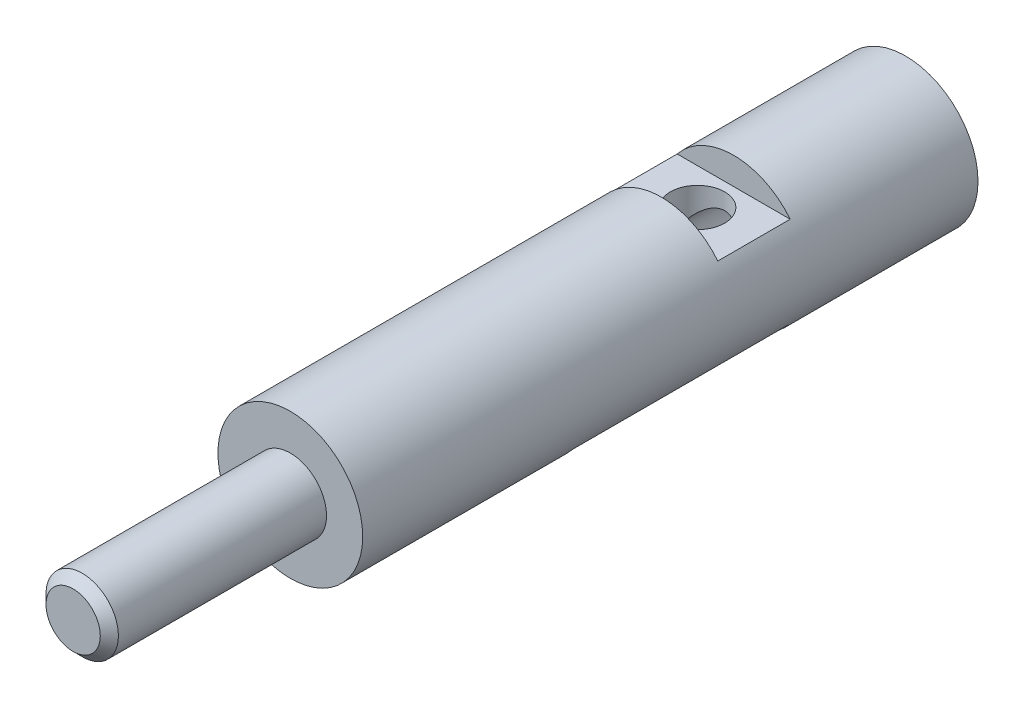
ISO-10303-21;
HEADER;
FILE_DESCRIPTION(('STEP AP214'),'2;1');
FILE_NAME('part.step','',(''),(''),'','','');
FILE_SCHEMA(('AUTOMOTIVE_DESIGN { 1 0 10303 214 1 1 1 1 }'));
ENDSEC;
DATA;
#1=APPLICATION_CONTEXT('core data for automotive mechanical design processes');
#2=APPLICATION_PROTOCOL_DEFINITION('international standard','automotive_design',2000,#1);
#3=PRODUCT_CONTEXT('',#1,'mechanical');
#4=PRODUCT('Part','Part','',(#3));
#5=PRODUCT_RELATED_PRODUCT_CATEGORY('part','',(#4));
#6=PRODUCT_DEFINITION_FORMATION('','',#4);
#7=PRODUCT_DEFINITION_CONTEXT('part definition',#1,'design');
#8=PRODUCT_DEFINITION('design','',#6,#7);
#9=PRODUCT_DEFINITION_SHAPE('','',#8);
#10=(LENGTH_UNIT() NAMED_UNIT(*) SI_UNIT(.MILLI.,.METRE.));
#11=(NAMED_UNIT(*) PLANE_ANGLE_UNIT() SI_UNIT($,.RADIAN.));
#12=(NAMED_UNIT(*) SI_UNIT($,.STERADIAN.) SOLID_ANGLE_UNIT());
#13=UNCERTAINTY_MEASURE_WITH_UNIT(LENGTH_MEASURE(1.E-05),#10,'distance_accuracy_value','');
#14=(GEOMETRIC_REPRESENTATION_CONTEXT(3) GLOBAL_UNCERTAINTY_ASSIGNED_CONTEXT((#13)) GLOBAL_UNIT_ASSIGNED_CONTEXT((#10,
#11,#12)) REPRESENTATION_CONTEXT('',''));
#15=CARTESIAN_POINT('',(0.,0.,0.));
#16=DIRECTION('',(0.,0.,1.));
#17=DIRECTION('',(1.,0.,0.));
#18=AXIS2_PLACEMENT_3D('',#15,#16,#17);
#19=CARTESIAN_POINT('',(0.,0.,-34.));
#20=DIRECTION('',(0.,0.,1.));
#21=DIRECTION('',(1.,0.,0.));
#22=AXIS2_PLACEMENT_3D('',#19,#20,#21);
#23=CYLINDRICAL_SURFACE('',#22,4.);
#24=DIRECTION('',(0.,0.,1.));
#25=VECTOR('',#24,1.);
#26=CARTESIAN_POINT('',(-3.1224989991992,-2.5,-34.));
#27=LINE('',#26,#25);
#28=CARTESIAN_POINT('',(-3.1224989991992,-2.5,-12.5));
#29=VERTEX_POINT('',#28);
#30=CARTESIAN_POINT('',(-3.1224989991992,-2.5,-24.5));
#31=VERTEX_POINT('',#30);
#32=EDGE_CURVE('E11',#29,#31,#27,.F.);
#33=ORIENTED_EDGE('',*,*,#32,.F.);
#34=CARTESIAN_POINT('',(0.,0.,-12.5));
#35=DIRECTION('',(0.,0.,1.));
#36=DIRECTION('',(1.,0.,0.));
#37=AXIS2_PLACEMENT_3D('',#34,#35,#36);
#38=CIRCLE('',#37,4.);
#39=CARTESIAN_POINT('',(3.1224989991992,-2.5,-12.5));
#40=VERTEX_POINT('',#39);
#41=EDGE_CURVE('E131',#40,#29,#38,.F.);
#42=ORIENTED_EDGE('',*,*,#41,.F.);
#43=DIRECTION('',(0.,0.,1.));
#44=VECTOR('',#43,1.);
#45=CARTESIAN_POINT('',(3.1224989991992,-2.5,-34.));
#46=LINE('',#45,#44);
#47=CARTESIAN_POINT('',(3.1224989991992,-2.5,-24.5));
#48=VERTEX_POINT('',#47);
#49=EDGE_CURVE('E95',#48,#40,#46,.T.);
#50=ORIENTED_EDGE('',*,*,#49,.F.);
#51=CARTESIAN_POINT('',(0.,0.,-24.5));
#52=DIRECTION('',(0.,0.,-1.));
#53=DIRECTION('',(-1.,0.,0.));
#54=AXIS2_PLACEMENT_3D('',#51,#52,#53);
#55=CIRCLE('',#54,4.);
#56=EDGE_CURVE('E45',#31,#48,#55,.F.);
#57=ORIENTED_EDGE('',*,*,#56,.F.);
#58=EDGE_LOOP('',(#33,#42,#50,#57));
#59=FACE_BOUND('',#58,.T.);
#60=CARTESIAN_POINT('',(0.,0.,-20.5));
#61=DIRECTION('',(0.,0.,1.));
#62=DIRECTION('',(1.,0.,0.));
#63=AXIS2_PLACEMENT_3D('',#60,#61,#62);
#64=CIRCLE('',#63,4.);
#65=CARTESIAN_POINT('',(-3.1224989991992,2.5,-20.5));
#66=VERTEX_POINT('',#65);
#67=CARTESIAN_POINT('',(3.1224989991992,2.5,-20.5));
#68=VERTEX_POINT('',#67);
#69=EDGE_CURVE('E78',#66,#68,#64,.F.);
#70=ORIENTED_EDGE('',*,*,#69,.F.);
#71=DIRECTION('',(0.,0.,1.));
#72=VECTOR('',#71,1.);
#73=CARTESIAN_POINT('',(-3.1224989991992,2.5,-34.));
#74=LINE('',#73,#72);
#75=CARTESIAN_POINT('',(-3.1224989991992,2.5,-24.5));
#76=VERTEX_POINT('',#75);
#77=EDGE_CURVE('E81',#76,#66,#74,.T.);
#78=ORIENTED_EDGE('',*,*,#77,.F.);
#79=CARTESIAN_POINT('',(0.,0.,-24.5));
#80=DIRECTION('',(0.,0.,-1.));
#81=DIRECTION('',(-1.,0.,0.));
#82=AXIS2_PLACEMENT_3D('',#79,#80,#81);
#83=CIRCLE('',#82,4.);
#84=CARTESIAN_POINT('',(3.1224989991992,2.5,-24.5));
#85=VERTEX_POINT('',#84);
#86=EDGE_CURVE('E96',#85,#76,#83,.F.);
#87=ORIENTED_EDGE('',*,*,#86,.F.);
#88=DIRECTION('',(0.,0.,1.));
#89=VECTOR('',#88,1.);
#90=CARTESIAN_POINT('',(3.1224989991992,2.5,-34.));
#91=LINE('',#90,#89);
#92=EDGE_CURVE('E83',#68,#85,#91,.F.);
#93=ORIENTED_EDGE('',*,*,#92,.F.);
#94=EDGE_LOOP('',(#70,#78,#87,#93));
#95=FACE_BOUND('',#94,.T.);
#96=CARTESIAN_POINT('',(0.,0.,-34.));
#97=DIRECTION('',(0.,0.,1.));
#98=DIRECTION('',(1.,0.,0.));
#99=AXIS2_PLACEMENT_3D('',#96,#97,#98);
#100=CIRCLE('',#99,4.);
#101=CARTESIAN_POINT('',(4.,0.,-34.));
#102=VERTEX_POINT('',#101);
#103=EDGE_CURVE('E119',#102,#102,#100,.T.);
#104=ORIENTED_EDGE('',*,*,#103,.T.);
#105=EDGE_LOOP('',(#104));
#106=FACE_BOUND('',#105,.T.);
#107=CARTESIAN_POINT('',(0.,0.,0.));
#108=DIRECTION('',(0.,0.,1.));
#109=DIRECTION('',(1.,0.,0.));
#110=AXIS2_PLACEMENT_3D('',#107,#108,#109);
#111=CIRCLE('',#110,4.);
#112=CARTESIAN_POINT('',(4.,0.,0.));
#113=VERTEX_POINT('',#112);
#114=EDGE_CURVE('E114',#113,#113,#111,.T.);
#115=ORIENTED_EDGE('',*,*,#114,.F.);
#116=EDGE_LOOP('',(#115));
#117=FACE_BOUND('',#116,.T.);
#118=ADVANCED_FACE('F36',(#59,#95,#106,#117),#23,.T.);
#119=CARTESIAN_POINT('',(0.,0.,-34.));
#120=DIRECTION('',(0.,0.,1.));
#121=DIRECTION('',(1.,0.,0.));
#122=AXIS2_PLACEMENT_3D('',#119,#120,#121);
#123=PLANE('',#122);
#124=CARTESIAN_POINT('',(0.,0.,-34.));
#125=DIRECTION('',(0.,0.,-1.));
#126=DIRECTION('',(-1.,0.,0.));
#127=AXIS2_PLACEMENT_3D('',#124,#125,#126);
#128=CIRCLE('',#127,1.59999999999999);
#129=CARTESIAN_POINT('',(-1.59999999999999,0.,-34.));
#130=VERTEX_POINT('',#129);
#131=EDGE_CURVE('E107',#130,#130,#128,.T.);
#132=ORIENTED_EDGE('',*,*,#131,.F.);
#133=EDGE_LOOP('',(#132));
#134=FACE_BOUND('',#133,.T.);
#135=ORIENTED_EDGE('',*,*,#103,.F.);
#136=EDGE_LOOP('',(#135));
#137=FACE_BOUND('',#136,.T.);
#138=ADVANCED_FACE('F163',(#134,#137),#123,.F.);
#139=CARTESIAN_POINT('',(0.,0.,0.));
#140=DIRECTION('',(0.,0.,1.));
#141=DIRECTION('',(1.,0.,0.));
#142=AXIS2_PLACEMENT_3D('',#139,#140,#141);
#143=PLANE('',#142);
#144=CARTESIAN_POINT('',(0.,0.,0.));
#145=DIRECTION('',(0.,0.,1.));
#146=DIRECTION('',(1.,0.,0.));
#147=AXIS2_PLACEMENT_3D('',#144,#145,#146);
#148=CIRCLE('',#147,2.);
#149=CARTESIAN_POINT('',(2.,0.,0.));
#150=VERTEX_POINT('',#149);
#151=EDGE_CURVE('E115',#150,#150,#148,.T.);
#152=ORIENTED_EDGE('',*,*,#151,.F.);
#153=EDGE_LOOP('',(#152));
#154=FACE_BOUND('',#153,.T.);
#155=ORIENTED_EDGE('',*,*,#114,.T.);
#156=EDGE_LOOP('',(#155));
#157=FACE_BOUND('',#156,.T.);
#158=ADVANCED_FACE('F167',(#154,#157),#143,.T.);
#159=CARTESIAN_POINT('',(0.,0.,12.));
#160=DIRECTION('',(0.,0.,-1.));
#161=DIRECTION('',(-1.,0.,0.));
#162=AXIS2_PLACEMENT_3D('',#159,#160,#161);
#163=CYLINDRICAL_SURFACE('',#162,2.);
#164=CARTESIAN_POINT('',(0.,0.,11.5));
#165=DIRECTION('',(0.,0.,1.));
#166=DIRECTION('',(1.,0.,0.));
#167=AXIS2_PLACEMENT_3D('',#164,#165,#166);
#168=CIRCLE('',#167,2.);
#169=CARTESIAN_POINT('',(2.,0.,11.5));
#170=VERTEX_POINT('',#169);
#171=EDGE_CURVE('E87',#170,#170,#168,.F.);
#172=ORIENTED_EDGE('',*,*,#171,.T.);
#173=EDGE_LOOP('',(#172));
#174=FACE_BOUND('',#173,.T.);
#175=ORIENTED_EDGE('',*,*,#151,.T.);
#176=EDGE_LOOP('',(#175));
#177=FACE_BOUND('',#176,.T.);
#178=ADVANCED_FACE('F172',(#174,#177),#163,.T.);
#179=CARTESIAN_POINT('',(0.,0.,12.));
#180=DIRECTION('',(0.,0.,1.));
#181=DIRECTION('',(1.,0.,0.));
#182=AXIS2_PLACEMENT_3D('',#179,#180,#181);
#183=PLANE('',#182);
#184=CARTESIAN_POINT('',(0.,0.,12.));
#185=DIRECTION('',(0.,0.,1.));
#186=DIRECTION('',(1.,0.,0.));
#187=AXIS2_PLACEMENT_3D('',#184,#185,#186);
#188=CIRCLE('',#187,1.5);
#189=CARTESIAN_POINT('',(1.5,0.,12.));
#190=VERTEX_POINT('',#189);
#191=EDGE_CURVE('E118',#190,#190,#188,.T.);
#192=ORIENTED_EDGE('',*,*,#191,.T.);
#193=EDGE_LOOP('',(#192));
#194=FACE_BOUND('',#193,.T.);
#195=ADVANCED_FACE('F177',(#194),#183,.T.);
#196=CARTESIAN_POINT('',(0.,0.,12.));
#197=DIRECTION('',(0.,0.,-1.));
#198=DIRECTION('',(-1.,0.,0.));
#199=AXIS2_PLACEMENT_3D('',#196,#197,#198);
#200=CONICAL_SURFACE('',#199,1.5,0.785398163397441);
#201=ORIENTED_EDGE('',*,*,#171,.F.);
#202=EDGE_LOOP('',(#201));
#203=FACE_BOUND('',#202,.T.);
#204=ORIENTED_EDGE('',*,*,#191,.F.);
#205=EDGE_LOOP('',(#204));
#206=FACE_BOUND('',#205,.T.);
#207=ADVANCED_FACE('F39',(#203,#206),#200,.T.);
#208=CARTESIAN_POINT('',(0.,0.,-20.));
#209=DIRECTION('',(0.,0.,-1.));
#210=DIRECTION('',(-1.,0.,0.));
#211=AXIS2_PLACEMENT_3D('',#208,#209,#210);
#212=CONICAL_SURFACE('',#211,1.59999999999999,1.02974425867665);
#213=CARTESIAN_POINT('',(0.,0.,-19.0386230095559));
#214=VERTEX_POINT('',#213);
#215=VERTEX_LOOP('',#214);
#216=FACE_BOUND('',#215,.T.);
#217=CARTESIAN_POINT('',(0.,0.,-20.));
#218=DIRECTION('',(0.,0.,-1.));
#219=DIRECTION('',(-1.,0.,0.));
#220=AXIS2_PLACEMENT_3D('',#217,#218,#219);
#221=CIRCLE('',#220,1.59999999999999);
#222=CARTESIAN_POINT('',(-1.59999999999999,0.,-20.));
#223=VERTEX_POINT('',#222);
#224=EDGE_CURVE('E110',#223,#223,#221,.T.);
#225=ORIENTED_EDGE('',*,*,#224,.T.);
#226=EDGE_LOOP('',(#225));
#227=FACE_BOUND('',#226,.T.);
#228=ADVANCED_FACE('F182',(#216,#227),#212,.F.);
#229=CARTESIAN_POINT('',(0.,0.,-34.));
#230=DIRECTION('',(0.,0.,-1.));
#231=DIRECTION('',(-1.,0.,0.));
#232=AXIS2_PLACEMENT_3D('',#229,#230,#231);
#233=CYLINDRICAL_SURFACE('',#232,1.59999999999999);
#234=CARTESIAN_POINT('',(0.,1.59999999999999,-21.));
#235=CARTESIAN_POINT('',(0.0684255819523115,1.59999100993067,-21.0000090962978));
#236=CARTESIAN_POINT('',(0.136969761419658,1.59556467819542,-21.0047281971338));
#237=CARTESIAN_POINT('',(0.271820864103848,1.57821703920185,-21.0232539049869));
#238=CARTESIAN_POINT('',(0.338120531372211,1.56527051953187,-21.0370874831407));
#239=CARTESIAN_POINT('',(0.466029039157556,1.53204181361779,-21.0726973534836));
#240=CARTESIAN_POINT('',(0.527667983699459,1.51181264687308,-21.0944162480474));
#241=CARTESIAN_POINT('',(0.645624057326145,1.46533125031908,-21.1445358019232));
#242=CARTESIAN_POINT('',(0.701942648568485,1.43908068217026,-21.172934617905));
#243=CARTESIAN_POINT('',(0.830488511004102,1.37023549959972,-21.2478632281665));
#244=CARTESIAN_POINT('',(0.899909356040592,1.32532924968791,-21.2970760172881));
#245=CARTESIAN_POINT('',(1.02730053831725,1.22924745848653,-21.4038236725768));
#246=CARTESIAN_POINT('',(1.08523092595497,1.17805101301526,-21.4613864091608));
#247=CARTESIAN_POINT('',(1.17078105057247,1.09156202300322,-21.560920796247));
#248=CARTESIAN_POINT('',(1.20175833727903,1.05726375119173,-21.6009408086179));
#249=CARTESIAN_POINT('',(1.25930890566738,0.988010810145918,-21.6834986333497));
#250=CARTESIAN_POINT('',(1.28588281199331,0.953056234796473,-21.7260360874337));
#251=CARTESIAN_POINT('',(1.33467012957743,0.883435608136693,-21.8135864668672));
#252=CARTESIAN_POINT('',(1.35689236994422,0.848769112188214,-21.8585941376334));
#253=CARTESIAN_POINT('',(1.3970362278902,0.780917148192493,-21.9514994512178));
#254=CARTESIAN_POINT('',(1.4149635108398,0.747729776660344,-21.9993931815076));
#255=CARTESIAN_POINT('',(1.44158488802393,0.694574099514455,-22.0838822859475));
#256=CARTESIAN_POINT('',(1.45143080990949,0.673647073701059,-22.1195046105091));
#257=CARTESIAN_POINT('',(1.46874054388632,0.635016088570957,-22.1930368336448));
#258=CARTESIAN_POINT('',(1.47620697945578,0.61730858891845,-22.2309441576764));
#259=CARTESIAN_POINT('',(1.48710185280875,0.59050368055825,-22.3012201572755));
#260=CARTESIAN_POINT('',(1.49104694938892,0.580381760051778,-22.3331032235742));
#261=CARTESIAN_POINT('',(1.49689488628612,0.565132788162443,-22.3981894510155));
#262=CARTESIAN_POINT('',(1.49880415766172,0.559990012702316,-22.43138810952));
#263=CARTESIAN_POINT('',(1.50037685312532,0.555766816396757,-22.4985170672047));
#264=CARTESIAN_POINT('',(1.50002232907756,0.556734843369679,-22.5324510822661));
#265=CARTESIAN_POINT('',(1.49707243273785,0.564613886898896,-22.5995451956431));
#266=CARTESIAN_POINT('',(1.4944718971692,0.571538596916504,-22.6327033297862));
#267=CARTESIAN_POINT('',(1.48583868780731,0.593691355415244,-22.7107065522607));
#268=CARTESIAN_POINT('',(1.47883660489909,0.61115848127911,-22.7547767608288));
#269=CARTESIAN_POINT('',(1.46163501869308,0.651230780563985,-22.8398884700143));
#270=CARTESIAN_POINT('',(1.45142140048049,0.673858512219667,-22.8809155928408));
#271=CARTESIAN_POINT('',(1.42705633043944,0.724130291338575,-22.964295134449));
#272=CARTESIAN_POINT('',(1.41262082836606,0.752047417768069,-23.0063961883062));
#273=CARTESIAN_POINT('',(1.38053670392535,0.809448984794783,-23.0882594625083));
#274=CARTESIAN_POINT('',(1.36288484352602,0.838934983462915,-23.1280192719694));
#275=CARTESIAN_POINT('',(1.30513055308311,0.928246532931969,-23.2444222286512));
#276=CARTESIAN_POINT('',(1.26024681474812,0.988886891758755,-23.3181312163075));
#277=CARTESIAN_POINT('',(1.1522222614889,1.11350800341081,-23.4651426434821));
#278=CARTESIAN_POINT('',(1.08770668085879,1.17721837960239,-23.5376707660719));
#279=CARTESIAN_POINT('',(0.941971511717649,1.29672721862755,-23.6714935311562));
#280=CARTESIAN_POINT('',(0.860815124216952,1.35255430540363,-23.7328290638758));
#281=CARTESIAN_POINT('',(0.715544871064911,1.43250376355301,-23.8199381988512));
#282=CARTESIAN_POINT('',(0.656464639142331,1.46066194156334,-23.8504193629851));
#283=CARTESIAN_POINT('',(0.532380202594988,1.51030557076395,-23.9039676752676));
#284=CARTESIAN_POINT('',(0.467379935912664,1.53179541632509,-23.9270397063193));
#285=CARTESIAN_POINT('',(0.33215867953347,1.56671039192708,-23.964454412966));
#286=CARTESIAN_POINT('',(0.261898429302686,1.58006627656504,-23.9787221497356));
#287=CARTESIAN_POINT('',(0.118916949535167,1.59719349756616,-23.9970096377307));
#288=CARTESIAN_POINT('',(0.0461977442778965,1.60097253214485,-24.0010376200461));
#289=CARTESIAN_POINT('',(-0.0898241742949232,1.5987422645432,-23.9986581904231));
#290=CARTESIAN_POINT('',(-0.153173912852326,1.59389115980747,-23.9934855518758));
#291=CARTESIAN_POINT('',(-0.277753685333671,1.57696068243675,-23.975403365772));
#292=CARTESIAN_POINT('',(-0.338983446812114,1.56488038437404,-23.9624928276668));
#293=CARTESIAN_POINT('',(-0.457735986419063,1.53435147837037,-23.9297793136347));
#294=CARTESIAN_POINT('',(-0.515265285072292,1.51591445776733,-23.9099888781736));
#295=CARTESIAN_POINT('',(-0.625826321394367,1.47371929048371,-23.8645218804443));
#296=CARTESIAN_POINT('',(-0.678856869780198,1.44995974275386,-23.8388437683204));
#297=CARTESIAN_POINT('',(-0.804323666257094,1.38569203947423,-23.7690194645366));
#298=CARTESIAN_POINT('',(-0.873816485374856,1.34262645456978,-23.7219326921356));
#299=CARTESIAN_POINT('',(-1.00176463057464,1.25009328041173,-23.6194762183997));
#300=CARTESIAN_POINT('',(-1.06018192297002,1.20060457994,-23.5640791050474));
#301=CARTESIAN_POINT('',(-1.14747741148048,1.11605538641917,-23.467427064718));
#302=CARTESIAN_POINT('',(-1.17951966582664,1.08204019580845,-23.4280484924892));
#303=CARTESIAN_POINT('',(-1.23917518469031,1.01317225735417,-23.3467515587635));
#304=CARTESIAN_POINT('',(-1.26678887424383,0.978319590257882,-23.3048334415346));
#305=CARTESIAN_POINT('',(-1.31764191463906,0.908666765165579,-23.2185566928481));
#306=CARTESIAN_POINT('',(-1.3408897200146,0.87386663788399,-23.1742029978392));
#307=CARTESIAN_POINT('',(-1.38309994332713,0.805383294233543,-23.0827298984665));
#308=CARTESIAN_POINT('',(-1.40206704077596,0.771698892914996,-23.0356135858014));
#309=CARTESIAN_POINT('',(-1.43080243256963,0.716573830570112,-22.9518434003516));
#310=CARTESIAN_POINT('',(-1.44164985062664,0.694387989717442,-22.9160542008122));
#311=CARTESIAN_POINT('',(-1.46094173101544,0.652817311175956,-22.842208361234));
#312=CARTESIAN_POINT('',(-1.46938663186735,0.633431962644846,-22.8041521365202));
#313=CARTESIAN_POINT('',(-1.48226072963674,0.602605017567063,-22.7323453147986));
#314=CARTESIAN_POINT('',(-1.4871367841298,0.590364021627841,-22.6990307214481));
#315=CARTESIAN_POINT('',(-1.49468197065955,0.570995915270086,-22.6307524923585));
#316=CARTESIAN_POINT('',(-1.49735937115688,0.563849658605712,-22.5957955624773));
#317=CARTESIAN_POINT('',(-1.50022554535816,0.556188195946323,-22.5245568122864));
#318=CARTESIAN_POINT('',(-1.50038283453941,0.555756883688056,-22.4882639002271));
#319=CARTESIAN_POINT('',(-1.4980998148631,0.561875339118326,-22.4163325816119));
#320=CARTESIAN_POINT('',(-1.49565398700772,0.568439939227091,-22.380695729265));
#321=CARTESIAN_POINT('',(-1.48749788637684,0.589493082818544,-22.3016563649174));
#322=CARTESIAN_POINT('',(-1.48107662983668,0.605660277513019,-22.2588024446772));
#323=CARTESIAN_POINT('',(-1.46519284514556,0.643137620116819,-22.175957538847));
#324=CARTESIAN_POINT('',(-1.45571686428683,0.664470411421129,-22.1359801921781));
#325=CARTESIAN_POINT('',(-1.43308878736763,0.712049693883297,-22.0548129753519));
#326=CARTESIAN_POINT('',(-1.41967554469702,0.738569250729468,-22.0138601198267));
#327=CARTESIAN_POINT('',(-1.38985030146092,0.793280785771147,-21.9342061780958));
#328=CARTESIAN_POINT('',(-1.37343521142805,0.821474466580521,-21.8955074664367));
#329=CARTESIAN_POINT('',(-1.31974256303737,0.907082200617729,-21.7821589547871));
#330=CARTESIAN_POINT('',(-1.27803283329951,0.965488439995807,-21.7103094131892));
#331=CARTESIAN_POINT('',(-1.17693332909145,1.08712656870904,-21.5653838564812));
#332=CARTESIAN_POINT('',(-1.11604484000422,1.15012229053255,-21.4931500874728));
#333=CARTESIAN_POINT('',(-0.978384321159562,1.26925092061589,-21.3589749614362));
#334=CARTESIAN_POINT('',(-0.901663440053429,1.32540502482403,-21.2970015909359));
#335=CARTESIAN_POINT('',(-0.761516551758972,1.40863661354698,-21.2059900545818));
#336=CARTESIAN_POINT('',(-0.702656139422148,1.43905674895606,-21.1729707472108));
#337=CARTESIAN_POINT('',(-0.578477152845047,1.49329683004648,-21.1143373223451));
#338=CARTESIAN_POINT('',(-0.513162974258379,1.51712122660306,-21.0887182106105));
#339=CARTESIAN_POINT('',(-0.38620040814023,1.55390938239854,-21.0492492504271));
#340=CARTESIAN_POINT('',(-0.325189090831707,1.56788580592605,-21.0342986233955));
#341=CARTESIAN_POINT('',(-0.200670425393364,1.58861097203541,-21.0121489553886));
#342=CARTESIAN_POINT('',(-0.137170487817847,1.59537969972829,-21.0049284803625));
#343=CARTESIAN_POINT('',(-0.0489577110307394,1.59944074803711,-21.0005966544392));
#344=CARTESIAN_POINT('',(-0.0244864493340586,1.60000321714292,-20.9999967448427));
#345=CARTESIAN_POINT('',(0.,1.59999999999999,-21.));
#346=B_SPLINE_CURVE_WITH_KNOTS('',3,(#234,#235,#236,#237,#238,#239,#240,#241,#242,#243,#244,
#245,#246,#247,#248,#249,#250,#251,#252,#253,#254,#255,#256,#257,#258,#259,#260,#261,#262,#263,
#264,#265,#266,#267,#268,#269,#270,#271,#272,#273,#274,#275,#276,#277,#278,#279,#280,#281,#282,
#283,#284,#285,#286,#287,#288,#289,#290,#291,#292,#293,#294,#295,#296,#297,#298,#299,#300,#301,
#302,#303,#304,#305,#306,#307,#308,#309,#310,#311,#312,#313,#314,#315,#316,#317,#318,#319,#320,
#321,#322,#323,#324,#325,#326,#327,#328,#329,#330,#331,#332,#333,#334,#335,#336,#337,#338,#339,
#340,#341,#342,#343,#344,#345),.UNSPECIFIED.,.T.,.F.,(4,2,2,2,2,2,2,2,2,2,2,2,2,2,2,2,2,2,2,2,2,
2,2,2,2,2,2,2,2,2,2,2,2,2,2,2,2,2,2,2,2,2,2,2,2,2,2,2,2,2,2,2,2,2,2,4),(0.,0.205191194350401,
0.410992324539082,0.615324504475544,0.81960036478185,1.10668891633044,1.39475875441688,
1.57797159708169,1.76115842768928,1.94396964900547,2.1265383843133,2.25379522043879,
2.380911261514,2.48161669197437,2.58200304846302,2.68318628478433,2.78460274869496,
2.92755182236973,3.07113816175825,3.22851946560472,3.3860600955967,3.70135424338244,
4.04810638258293,4.39356518751196,4.60938269160767,4.82505767038768,5.04254394703589,
5.25985534488228,5.45015751158168,5.64048404456581,5.83046545960807,6.02049694236048,
6.30198386380244,6.58442057318483,6.76754781754563,6.95065747555072,7.13340880043478,
7.31595937010019,7.44626722225466,7.57655127464996,7.68369231421016,7.79042855986851,
7.89849726875138,8.00679555674797,8.14477595318692,8.28337249894482,8.4349475782737,
8.5866795440114,8.89033594061585,9.22956287389839,9.56771058052486,9.7890215884635,
10.0101828873085,10.2024308125783,10.3941442839537,10.4675730169056),.UNSPECIFIED.);
#347=CARTESIAN_POINT('',(0.,1.59999999999999,-21.));
#348=VERTEX_POINT('',#347);
#349=EDGE_CURVE('E99',#348,#348,#346,.T.);
#350=ORIENTED_EDGE('',*,*,#349,.T.);
#351=EDGE_LOOP('',(#350));
#352=FACE_BOUND('',#351,.T.);
#353=ORIENTED_EDGE('',*,*,#224,.F.);
#354=EDGE_LOOP('',(#353));
#355=FACE_BOUND('',#354,.T.);
#356=ORIENTED_EDGE('',*,*,#131,.T.);
#357=EDGE_LOOP('',(#356));
#358=FACE_BOUND('',#357,.T.);
#359=ADVANCED_FACE('F185',(#352,#355,#358),#233,.F.);
#360=CARTESIAN_POINT('',(-4.,4.,-24.5));
#361=DIRECTION('',(0.,0.,-1.));
#362=DIRECTION('',(-1.,0.,0.));
#363=AXIS2_PLACEMENT_3D('',#360,#361,#362);
#364=PLANE('',#363);
#365=DIRECTION('',(1.,0.,0.));
#366=VECTOR('',#365,1.);
#367=CARTESIAN_POINT('',(-4.,2.5,-24.5));
#368=LINE('',#367,#366);
#369=EDGE_CURVE('E94',#76,#85,#368,.T.);
#370=ORIENTED_EDGE('',*,*,#369,.T.);
#371=ORIENTED_EDGE('',*,*,#86,.T.);
#372=EDGE_LOOP('',(#370,#371));
#373=FACE_BOUND('',#372,.T.);
#374=ADVANCED_FACE('F188',(#373),#364,.F.);
#375=CARTESIAN_POINT('',(-4.,2.5,-24.5));
#376=DIRECTION('',(0.,-1.,0.));
#377=DIRECTION('',(0.,0.,-1.));
#378=AXIS2_PLACEMENT_3D('',#375,#376,#377);
#379=PLANE('',#378);
#380=CARTESIAN_POINT('',(0.,2.5,-22.5));
#381=DIRECTION('',(0.,1.,0.));
#382=DIRECTION('',(0.,0.,1.));
#383=AXIS2_PLACEMENT_3D('',#380,#381,#382);
#384=CIRCLE('',#383,1.49999999999999);
#385=CARTESIAN_POINT('',(0.,2.5,-21.));
#386=VERTEX_POINT('',#385);
#387=EDGE_CURVE('E103',#386,#386,#384,.T.);
#388=ORIENTED_EDGE('',*,*,#387,.F.);
#389=EDGE_LOOP('',(#388));
#390=FACE_BOUND('',#389,.T.);
#391=ORIENTED_EDGE('',*,*,#92,.T.);
#392=ORIENTED_EDGE('',*,*,#369,.F.);
#393=ORIENTED_EDGE('',*,*,#77,.T.);
#394=DIRECTION('',(1.,0.,0.));
#395=VECTOR('',#394,1.);
#396=CARTESIAN_POINT('',(-4.,2.5,-20.5));
#397=LINE('',#396,#395);
#398=EDGE_CURVE('E92',#66,#68,#397,.T.);
#399=ORIENTED_EDGE('',*,*,#398,.T.);
#400=EDGE_LOOP('',(#391,#392,#393,#399));
#401=FACE_BOUND('',#400,.T.);
#402=ADVANCED_FACE('F91',(#390,#401),#379,.F.);
#403=CARTESIAN_POINT('',(-4.,4.,-20.5));
#404=DIRECTION('',(0.,0.,1.));
#405=DIRECTION('',(1.,0.,0.));
#406=AXIS2_PLACEMENT_3D('',#403,#404,#405);
#407=PLANE('',#406);
#408=ORIENTED_EDGE('',*,*,#398,.F.);
#409=ORIENTED_EDGE('',*,*,#69,.T.);
#410=EDGE_LOOP('',(#408,#409));
#411=FACE_BOUND('',#410,.T.);
#412=ADVANCED_FACE('F98',(#411),#407,.F.);
#413=CARTESIAN_POINT('',(-4.,-4.,-24.5));
#414=DIRECTION('',(0.,0.,-1.));
#415=DIRECTION('',(-1.,0.,0.));
#416=AXIS2_PLACEMENT_3D('',#413,#414,#415);
#417=PLANE('',#416);
#418=DIRECTION('',(1.,0.,0.));
#419=VECTOR('',#418,1.);
#420=CARTESIAN_POINT('',(-4.,-2.5,-24.5));
#421=LINE('',#420,#419);
#422=EDGE_CURVE('E51',#31,#48,#421,.T.);
#423=ORIENTED_EDGE('',*,*,#422,.F.);
#424=ORIENTED_EDGE('',*,*,#56,.T.);
#425=EDGE_LOOP('',(#423,#424));
#426=FACE_BOUND('',#425,.T.);
#427=ADVANCED_FACE('F134',(#426),#417,.F.);
#428=CARTESIAN_POINT('',(-4.,-4.,-12.5));
#429=DIRECTION('',(0.,0.,1.));
#430=DIRECTION('',(1.,0.,0.));
#431=AXIS2_PLACEMENT_3D('',#428,#429,#430);
#432=PLANE('',#431);
#433=ORIENTED_EDGE('',*,*,#41,.T.);
#434=DIRECTION('',(1.,0.,0.));
#435=VECTOR('',#434,1.);
#436=CARTESIAN_POINT('',(-4.,-2.5,-12.5));
#437=LINE('',#436,#435);
#438=EDGE_CURVE('E111',#29,#40,#437,.T.);
#439=ORIENTED_EDGE('',*,*,#438,.T.);
#440=EDGE_LOOP('',(#433,#439));
#441=FACE_BOUND('',#440,.T.);
#442=ADVANCED_FACE('F142',(#441),#432,.F.);
#443=CARTESIAN_POINT('',(-4.,-2.5,-24.5));
#444=DIRECTION('',(0.,1.,0.));
#445=DIRECTION('',(0.,0.,1.));
#446=AXIS2_PLACEMENT_3D('',#443,#444,#445);
#447=PLANE('',#446);
#448=ORIENTED_EDGE('',*,*,#32,.T.);
#449=ORIENTED_EDGE('',*,*,#422,.T.);
#450=ORIENTED_EDGE('',*,*,#49,.T.);
#451=ORIENTED_EDGE('',*,*,#438,.F.);
#452=EDGE_LOOP('',(#448,#449,#450,#451));
#453=FACE_BOUND('',#452,.T.);
#454=ADVANCED_FACE('F140',(#453),#447,.F.);
#455=CARTESIAN_POINT('',(0.,2.5,-22.5));
#456=DIRECTION('',(0.,1.,0.));
#457=DIRECTION('',(0.,0.,1.));
#458=AXIS2_PLACEMENT_3D('',#455,#456,#457);
#459=CYLINDRICAL_SURFACE('',#458,1.49999999999999);
#460=ORIENTED_EDGE('',*,*,#349,.F.);
#461=EDGE_LOOP('',(#460));
#462=FACE_BOUND('',#461,.T.);
#463=ORIENTED_EDGE('',*,*,#387,.T.);
#464=EDGE_LOOP('',(#463));
#465=FACE_BOUND('',#464,.T.);
#466=ADVANCED_FACE('F152',(#462,#465),#459,.F.);
#467=CLOSED_SHELL('',(#118,#138,#158,#178,#195,#207,#228,#359,#374,#402,#412,#427,#442,#454,#466));
#468=MANIFOLD_SOLID_BREP('B2',#467);
#469=ADVANCED_BREP_SHAPE_REPRESENTATION('',(#18,#468),#14);
#470=SHAPE_DEFINITION_REPRESENTATION(#9,#469);
ENDSEC;
END-ISO-10303-21;
